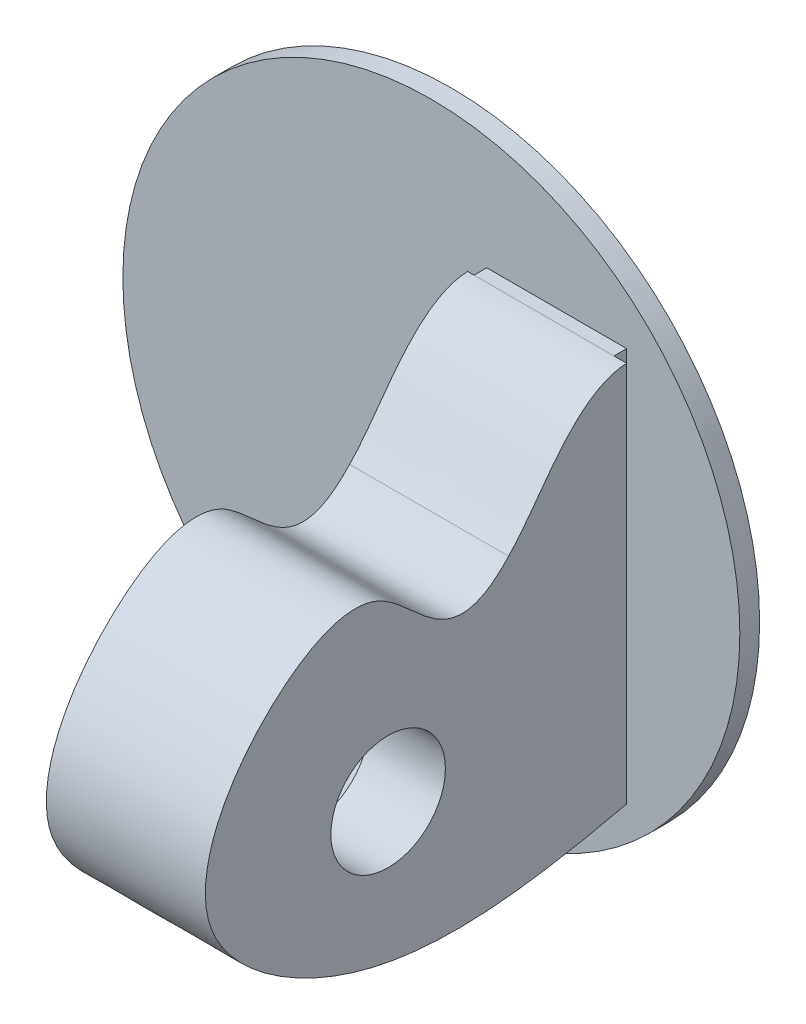
ISO-10303-21;
HEADER;
FILE_DESCRIPTION(('STEP AP214'),'2;1');
FILE_NAME('part.step','',(''),(''),'','','');
FILE_SCHEMA(('AUTOMOTIVE_DESIGN { 1 0 10303 214 1 1 1 1 }'));
ENDSEC;
DATA;
#1=APPLICATION_CONTEXT('core data for automotive mechanical design processes');
#2=APPLICATION_PROTOCOL_DEFINITION('international standard','automotive_design',2000,#1);
#3=PRODUCT_CONTEXT('',#1,'mechanical');
#4=PRODUCT('Part','Part','',(#3));
#5=PRODUCT_RELATED_PRODUCT_CATEGORY('part','',(#4));
#6=PRODUCT_DEFINITION_FORMATION('','',#4);
#7=PRODUCT_DEFINITION_CONTEXT('part definition',#1,'design');
#8=PRODUCT_DEFINITION('design','',#6,#7);
#9=PRODUCT_DEFINITION_SHAPE('','',#8);
#10=(LENGTH_UNIT() NAMED_UNIT(*) SI_UNIT(.MILLI.,.METRE.));
#11=(NAMED_UNIT(*) PLANE_ANGLE_UNIT() SI_UNIT($,.RADIAN.));
#12=(NAMED_UNIT(*) SI_UNIT($,.STERADIAN.) SOLID_ANGLE_UNIT());
#13=UNCERTAINTY_MEASURE_WITH_UNIT(LENGTH_MEASURE(1.E-05),#10,'distance_accuracy_value','');
#14=(GEOMETRIC_REPRESENTATION_CONTEXT(3) GLOBAL_UNCERTAINTY_ASSIGNED_CONTEXT((#13)) GLOBAL_UNIT_ASSIGNED_CONTEXT((#10,
#11,#12)) REPRESENTATION_CONTEXT('',''));
#15=CARTESIAN_POINT('',(0.,0.,0.));
#16=DIRECTION('',(0.,0.,1.));
#17=DIRECTION('',(1.,0.,0.));
#18=AXIS2_PLACEMENT_3D('',#15,#16,#17);
#19=CARTESIAN_POINT('',(0.,0.,3.1112810740788));
#20=DIRECTION('',(0.,0.,1.));
#21=DIRECTION('',(1.,0.,0.));
#22=AXIS2_PLACEMENT_3D('',#19,#20,#21);
#23=PLANE('',#22);
#24=CARTESIAN_POINT('',(0.,0.,3.1112810740788));
#25=DIRECTION('',(0.,0.,1.));
#26=DIRECTION('',(1.,0.,0.));
#27=AXIS2_PLACEMENT_3D('',#24,#25,#26);
#28=CIRCLE('',#27,48.5);
#29=CARTESIAN_POINT('',(48.5,0.,3.1112810740788));
#30=VERTEX_POINT('',#29);
#31=EDGE_CURVE('E11',#30,#30,#28,.T.);
#32=ORIENTED_EDGE('',*,*,#31,.T.);
#33=EDGE_LOOP('',(#32));
#34=FACE_BOUND('',#33,.T.);
#35=DIRECTION('',(-1.,0.,0.));
#36=VECTOR('',#35,1.);
#37=CARTESIAN_POINT('',(30.7069914702559,29.9017374355421,3.1112810740788));
#38=LINE('',#37,#36);
#39=CARTESIAN_POINT('',(30.7069914702559,29.9017374355421,3.1112810740788));
#40=VERTEX_POINT('',#39);
#41=CARTESIAN_POINT('',(8.70699147025594,29.9017374355421,3.1112810740788));
#42=VERTEX_POINT('',#41);
#43=EDGE_CURVE('E270',#40,#42,#38,.T.);
#44=ORIENTED_EDGE('',*,*,#43,.F.);
#45=DIRECTION('',(0.,1.,0.));
#46=VECTOR('',#45,1.);
#47=CARTESIAN_POINT('',(30.7069914702559,29.9017374355421,3.1112810740788));
#48=LINE('',#47,#46);
#49=CARTESIAN_POINT('',(30.7069914702559,-30.0982625644579,3.1112810740788));
#50=VERTEX_POINT('',#49);
#51=EDGE_CURVE('E273',#50,#40,#48,.T.);
#52=ORIENTED_EDGE('',*,*,#51,.F.);
#53=DIRECTION('',(1.,0.,0.));
#54=VECTOR('',#53,1.);
#55=CARTESIAN_POINT('',(30.7069914702559,-30.0982625644579,3.1112810740788));
#56=LINE('',#55,#54);
#57=CARTESIAN_POINT('',(8.70699147025594,-30.0982625644579,3.1112810740788));
#58=VERTEX_POINT('',#57);
#59=EDGE_CURVE('E263',#58,#50,#56,.T.);
#60=ORIENTED_EDGE('',*,*,#59,.F.);
#61=DIRECTION('',(0.,-1.,0.));
#62=VECTOR('',#61,1.);
#63=CARTESIAN_POINT('',(8.70699147025594,29.9017374355421,3.1112810740788));
#64=LINE('',#63,#62);
#65=EDGE_CURVE('E267',#42,#58,#64,.T.);
#66=ORIENTED_EDGE('',*,*,#65,.F.);
#67=EDGE_LOOP('',(#44,#52,#60,#66));
#68=FACE_BOUND('',#67,.T.);
#69=ADVANCED_FACE('F44',(#34,#68),#23,.T.);
#70=CARTESIAN_POINT('',(0.,0.,3.1112810740788));
#71=DIRECTION('',(0.,0.,-1.));
#72=DIRECTION('',(-1.,0.,0.));
#73=AXIS2_PLACEMENT_3D('',#70,#71,#72);
#74=CYLINDRICAL_SURFACE('',#73,48.5);
#75=ORIENTED_EDGE('',*,*,#31,.F.);
#76=EDGE_LOOP('',(#75));
#77=FACE_BOUND('',#76,.T.);
#78=CARTESIAN_POINT('',(0.,0.,0.));
#79=DIRECTION('',(0.,0.,1.));
#80=DIRECTION('',(1.,0.,0.));
#81=AXIS2_PLACEMENT_3D('',#78,#79,#80);
#82=CIRCLE('',#81,48.5);
#83=CARTESIAN_POINT('',(48.5,0.,0.));
#84=VERTEX_POINT('',#83);
#85=EDGE_CURVE('E48',#84,#84,#82,.T.);
#86=ORIENTED_EDGE('',*,*,#85,.T.);
#87=EDGE_LOOP('',(#86));
#88=FACE_BOUND('',#87,.T.);
#89=ADVANCED_FACE('F46',(#77,#88),#74,.T.);
#90=CARTESIAN_POINT('',(0.,0.,0.));
#91=DIRECTION('',(0.,0.,1.));
#92=DIRECTION('',(1.,0.,0.));
#93=AXIS2_PLACEMENT_3D('',#90,#91,#92);
#94=PLANE('',#93);
#95=ORIENTED_EDGE('',*,*,#85,.F.);
#96=EDGE_LOOP('',(#95));
#97=FACE_BOUND('',#96,.T.);
#98=ADVANCED_FACE('F232',(#97),#94,.F.);
#99=CARTESIAN_POINT('',(30.7069914702559,29.9017374355421,5.1112810740788));
#100=DIRECTION('',(-1.,0.,0.));
#101=DIRECTION('',(0.,0.,1.));
#102=AXIS2_PLACEMENT_3D('',#99,#100,#101);
#103=PLANE('',#102);
#104=ORIENTED_EDGE('',*,*,#51,.T.);
#105=DIRECTION('',(0.,0.,-1.));
#106=VECTOR('',#105,1.);
#107=CARTESIAN_POINT('',(30.7069914702559,29.9017374355421,5.1112810740788));
#108=LINE('',#107,#106);
#109=CARTESIAN_POINT('',(30.7069914702559,29.9017374355421,5.1112810740788));
#110=VERTEX_POINT('',#109);
#111=EDGE_CURVE('E246',#110,#40,#108,.T.);
#112=ORIENTED_EDGE('',*,*,#111,.F.);
#113=DIRECTION('',(0.,1.,0.));
#114=VECTOR('',#113,1.);
#115=CARTESIAN_POINT('',(30.7069914702559,29.9017374355421,5.1112810740788));
#116=LINE('',#115,#114);
#117=CARTESIAN_POINT('',(30.7069914702559,-30.0982625644579,5.1112810740788));
#118=VERTEX_POINT('',#117);
#119=EDGE_CURVE('E266',#118,#110,#116,.T.);
#120=ORIENTED_EDGE('',*,*,#119,.F.);
#121=DIRECTION('',(0.,0.,-1.));
#122=VECTOR('',#121,1.);
#123=CARTESIAN_POINT('',(30.7069914702559,-30.0982625644579,5.1112810740788));
#124=LINE('',#123,#122);
#125=EDGE_CURVE('E258',#118,#50,#124,.T.);
#126=ORIENTED_EDGE('',*,*,#125,.T.);
#127=EDGE_LOOP('',(#104,#112,#120,#126));
#128=FACE_BOUND('',#127,.T.);
#129=ADVANCED_FACE('F228',(#128),#103,.F.);
#130=CARTESIAN_POINT('',(30.7069914702559,29.9017374355421,5.1112810740788));
#131=DIRECTION('',(0.,-1.,0.));
#132=DIRECTION('',(0.,0.,-1.));
#133=AXIS2_PLACEMENT_3D('',#130,#131,#132);
#134=PLANE('',#133);
#135=ORIENTED_EDGE('',*,*,#43,.T.);
#136=DIRECTION('',(0.,0.,-1.));
#137=VECTOR('',#136,1.);
#138=CARTESIAN_POINT('',(8.70699147025594,29.9017374355421,5.1112810740788));
#139=LINE('',#138,#137);
#140=CARTESIAN_POINT('',(8.70699147025594,29.9017374355421,5.1112810740788));
#141=VERTEX_POINT('',#140);
#142=EDGE_CURVE('E248',#141,#42,#139,.T.);
#143=ORIENTED_EDGE('',*,*,#142,.F.);
#144=DIRECTION('',(-1.,0.,0.));
#145=VECTOR('',#144,1.);
#146=CARTESIAN_POINT('',(30.7069914702559,29.9017374355421,5.1112810740788));
#147=LINE('',#146,#145);
#148=EDGE_CURVE('E284',#110,#141,#147,.T.);
#149=ORIENTED_EDGE('',*,*,#148,.F.);
#150=ORIENTED_EDGE('',*,*,#111,.T.);
#151=EDGE_LOOP('',(#135,#143,#149,#150));
#152=FACE_BOUND('',#151,.T.);
#153=ADVANCED_FACE('F224',(#152),#134,.F.);
#154=CARTESIAN_POINT('',(8.70699147025594,29.9017374355421,5.1112810740788));
#155=DIRECTION('',(1.,0.,0.));
#156=DIRECTION('',(0.,1.,0.));
#157=AXIS2_PLACEMENT_3D('',#154,#155,#156);
#158=PLANE('',#157);
#159=ORIENTED_EDGE('',*,*,#65,.T.);
#160=DIRECTION('',(0.,0.,-1.));
#161=VECTOR('',#160,1.);
#162=CARTESIAN_POINT('',(8.70699147025594,-30.0982625644579,5.1112810740788));
#163=LINE('',#162,#161);
#164=CARTESIAN_POINT('',(8.70699147025594,-30.0982625644579,5.1112810740788));
#165=VERTEX_POINT('',#164);
#166=EDGE_CURVE('E68',#165,#58,#163,.T.);
#167=ORIENTED_EDGE('',*,*,#166,.F.);
#168=DIRECTION('',(0.,-1.,0.));
#169=VECTOR('',#168,1.);
#170=CARTESIAN_POINT('',(8.70699147025594,29.9017374355421,5.1112810740788));
#171=LINE('',#170,#169);
#172=EDGE_CURVE('E280',#141,#165,#171,.T.);
#173=ORIENTED_EDGE('',*,*,#172,.F.);
#174=ORIENTED_EDGE('',*,*,#142,.T.);
#175=EDGE_LOOP('',(#159,#167,#173,#174));
#176=FACE_BOUND('',#175,.T.);
#177=ADVANCED_FACE('F221',(#176),#158,.F.);
#178=CARTESIAN_POINT('',(30.7069914702559,-30.0982625644579,5.1112810740788));
#179=DIRECTION('',(0.,1.,0.));
#180=DIRECTION('',(-1.,0.,0.));
#181=AXIS2_PLACEMENT_3D('',#178,#179,#180);
#182=PLANE('',#181);
#183=ORIENTED_EDGE('',*,*,#59,.T.);
#184=ORIENTED_EDGE('',*,*,#125,.F.);
#185=DIRECTION('',(1.,0.,0.));
#186=VECTOR('',#185,1.);
#187=CARTESIAN_POINT('',(30.7069914702559,-30.0982625644579,5.1112810740788));
#188=LINE('',#187,#186);
#189=EDGE_CURVE('E262',#165,#118,#188,.T.);
#190=ORIENTED_EDGE('',*,*,#189,.F.);
#191=ORIENTED_EDGE('',*,*,#166,.T.);
#192=EDGE_LOOP('',(#183,#184,#190,#191));
#193=FACE_BOUND('',#192,.T.);
#194=ADVANCED_FACE('F217',(#193),#182,.F.);
#195=CARTESIAN_POINT('',(7.70699147025594,0.,5.1112810740788));
#196=DIRECTION('',(0.,0.,1.));
#197=DIRECTION('',(1.,0.,0.));
#198=AXIS2_PLACEMENT_3D('',#195,#196,#197);
#199=PLANE('',#198);
#200=DIRECTION('',(1.,0.,0.));
#201=VECTOR('',#200,1.);
#202=CARTESIAN_POINT('',(7.70699147025594,-30.0982625644579,5.1112810740788));
#203=LINE('',#202,#201);
#204=CARTESIAN_POINT('',(32.7069914702559,-30.0982625644579,5.1112810740788));
#205=VERTEX_POINT('',#204);
#206=EDGE_CURVE('E294',#118,#205,#203,.T.);
#207=ORIENTED_EDGE('',*,*,#206,.F.);
#208=ORIENTED_EDGE('',*,*,#119,.T.);
#209=DIRECTION('',(1.,0.,0.));
#210=VECTOR('',#209,1.);
#211=CARTESIAN_POINT('',(7.70699147025594,29.9017374355421,5.1112810740788));
#212=LINE('',#211,#210);
#213=CARTESIAN_POINT('',(32.7069914702559,29.9017374355421,5.1112810740788));
#214=VERTEX_POINT('',#213);
#215=EDGE_CURVE('E300',#110,#214,#212,.T.);
#216=ORIENTED_EDGE('',*,*,#215,.T.);
#217=DIRECTION('',(0.,-1.,0.));
#218=VECTOR('',#217,1.);
#219=CARTESIAN_POINT('',(32.7069914702559,0.,5.1112810740788));
#220=LINE('',#219,#218);
#221=EDGE_CURVE('E186',#214,#205,#220,.T.);
#222=ORIENTED_EDGE('',*,*,#221,.T.);
#223=EDGE_LOOP('',(#207,#208,#216,#222));
#224=FACE_BOUND('',#223,.T.);
#225=ADVANCED_FACE('F220',(#224),#199,.F.);
#226=CARTESIAN_POINT('',(7.70699147025594,29.9017374355421,5.1112810740788));
#227=VERTEX_POINT('',#226);
#228=EDGE_CURVE('E276',#227,#141,#212,.T.);
#229=ORIENTED_EDGE('',*,*,#228,.T.);
#230=ORIENTED_EDGE('',*,*,#172,.T.);
#231=CARTESIAN_POINT('',(7.70699147025594,-30.0982625644579,5.1112810740788));
#232=VERTEX_POINT('',#231);
#233=EDGE_CURVE('E296',#232,#165,#203,.T.);
#234=ORIENTED_EDGE('',*,*,#233,.F.);
#235=DIRECTION('',(0.,-1.,0.));
#236=VECTOR('',#235,1.);
#237=CARTESIAN_POINT('',(7.70699147025594,0.,5.1112810740788));
#238=LINE('',#237,#236);
#239=EDGE_CURVE('E295',#227,#232,#238,.T.);
#240=ORIENTED_EDGE('',*,*,#239,.F.);
#241=EDGE_LOOP('',(#229,#230,#234,#240));
#242=FACE_BOUND('',#241,.T.);
#243=ADVANCED_FACE('F214',(#242),#199,.F.);
#244=CARTESIAN_POINT('',(7.70699147025594,12.9185801119361,23.6727907810343));
#245=CARTESIAN_POINT('',(7.70699147025594,17.4253852348461,19.019771768427));
#246=CARTESIAN_POINT('',(7.70699147025594,30.54597843189,13.1044488589579));
#247=CARTESIAN_POINT('',(7.70699147025594,29.8774269491727,3.77192315663627));
#248=CARTESIAN_POINT('',(7.70699147025594,29.9017374355421,3.11128107407879));
#249=B_SPLINE_CURVE_WITH_KNOTS('',3,(#244,#245,#246,#247,#248),.UNSPECIFIED.,.F.,.F.,(4,1,4),
(0.,0.927274153157038,1.),.UNSPECIFIED.);
#250=DIRECTION('',(1.,0.,0.));
#251=VECTOR('',#250,1.);
#252=SURFACE_OF_LINEAR_EXTRUSION('',#249,#251);
#253=DIRECTION('',(1.,0.,0.));
#254=VECTOR('',#253,1.);
#255=CARTESIAN_POINT('',(7.70699147025594,12.9185801119361,23.6727907810343));
#256=LINE('',#255,#254);
#257=CARTESIAN_POINT('',(7.70699147025594,12.9185801119361,23.6727907810343));
#258=VERTEX_POINT('',#257);
#259=CARTESIAN_POINT('',(32.7069914702559,12.9185801119361,23.6727907810343));
#260=VERTEX_POINT('',#259);
#261=EDGE_CURVE('E291',#258,#260,#256,.T.);
#262=ORIENTED_EDGE('',*,*,#261,.T.);
#263=CARTESIAN_POINT('',(32.7069914702559,12.9185801119361,23.6727907810343));
#264=CARTESIAN_POINT('',(32.7069914702559,17.4253852348461,19.019771768427));
#265=CARTESIAN_POINT('',(32.7069914702559,30.54597843189,13.1044488589579));
#266=CARTESIAN_POINT('',(32.7069914702559,29.8774269491727,3.77192315663627));
#267=CARTESIAN_POINT('',(32.7069914702559,29.9017374355421,3.11128107407879));
#268=B_SPLINE_CURVE_WITH_KNOTS('',3,(#263,#264,#265,#266,#267),.UNSPECIFIED.,.F.,.F.,(4,1,4),
(0.,0.927274153157038,1.),.UNSPECIFIED.);
#269=EDGE_CURVE('E154',#260,#214,#268,.T.);
#270=ORIENTED_EDGE('',*,*,#269,.T.);
#271=ORIENTED_EDGE('',*,*,#215,.F.);
#272=ORIENTED_EDGE('',*,*,#148,.T.);
#273=ORIENTED_EDGE('',*,*,#228,.F.);
#274=EDGE_CURVE('E193',#258,#227,#249,.T.);
#275=ORIENTED_EDGE('',*,*,#274,.F.);
#276=EDGE_LOOP('',(#262,#270,#271,#272,#273,#275));
#277=FACE_BOUND('',#276,.T.);
#278=ADVANCED_FACE('F209',(#277),#252,.F.);
#279=CARTESIAN_POINT('',(7.70699147025594,-30.0982625644579,5.11128107407879));
#280=CARTESIAN_POINT('',(7.70699147025594,-33.7436246575606,21.0676828271333));
#281=CARTESIAN_POINT('',(7.70699147025594,-37.9349639980134,45.9770740835832));
#282=CARTESIAN_POINT('',(7.70699147025594,-13.9107640488883,77.0147211662298));
#283=CARTESIAN_POINT('',(7.70699147025594,10.4858105730502,65.3805760032116));
#284=CARTESIAN_POINT('',(7.70699147025594,23.797763225656,41.8970754374423));
#285=CARTESIAN_POINT('',(7.70699147025594,2.78348011007688,33.0376365020306));
#286=CARTESIAN_POINT('',(7.70699147025594,12.9185801119361,23.6727907810343));
#287=B_SPLINE_CURVE_WITH_KNOTS('',3,(#279,#280,#281,#282,#283,#284,#285,#286),.UNSPECIFIED.,.F.,
.F.,(4,1,1,1,1,4),(0.,0.3600579269767,0.526916248276504,0.718382938550825,0.849564348586135,1.),.UNSPECIFIED.);
#288=DIRECTION('',(1.,0.,0.));
#289=VECTOR('',#288,1.);
#290=SURFACE_OF_LINEAR_EXTRUSION('',#287,#289);
#291=ORIENTED_EDGE('',*,*,#233,.T.);
#292=ORIENTED_EDGE('',*,*,#189,.T.);
#293=ORIENTED_EDGE('',*,*,#206,.T.);
#294=CARTESIAN_POINT('',(32.7069914702559,-30.0982625644579,5.11128107407879));
#295=CARTESIAN_POINT('',(32.7069914702559,-33.7436246575606,21.0676828271333));
#296=CARTESIAN_POINT('',(32.7069914702559,-37.9349639980134,45.9770740835832));
#297=CARTESIAN_POINT('',(32.7069914702559,-13.9107640488883,77.0147211662298));
#298=CARTESIAN_POINT('',(32.7069914702559,10.4858105730502,65.3805760032116));
#299=CARTESIAN_POINT('',(32.7069914702559,23.797763225656,41.8970754374423));
#300=CARTESIAN_POINT('',(32.7069914702559,2.78348011007688,33.0376365020306));
#301=CARTESIAN_POINT('',(32.7069914702559,12.9185801119361,23.6727907810343));
#302=B_SPLINE_CURVE_WITH_KNOTS('',3,(#294,#295,#296,#297,#298,#299,#300,#301),.UNSPECIFIED.,.F.,
.F.,(4,1,1,1,1,4),(0.,0.3600579269767,0.526916248276504,0.718382938550825,0.849564348586135,1.),.UNSPECIFIED.);
#303=EDGE_CURVE('E159',#205,#260,#302,.T.);
#304=ORIENTED_EDGE('',*,*,#303,.T.);
#305=ORIENTED_EDGE('',*,*,#261,.F.);
#306=EDGE_CURVE('E200',#232,#258,#287,.T.);
#307=ORIENTED_EDGE('',*,*,#306,.F.);
#308=EDGE_LOOP('',(#291,#292,#293,#304,#305,#307));
#309=FACE_BOUND('',#308,.T.);
#310=ADVANCED_FACE('F213',(#309),#290,.F.);
#311=CARTESIAN_POINT('',(7.70699147025594,0.,0.));
#312=DIRECTION('',(1.,0.,0.));
#313=DIRECTION('',(0.,0.,-1.));
#314=AXIS2_PLACEMENT_3D('',#311,#312,#313);
#315=PLANE('',#314);
#316=CARTESIAN_POINT('',(7.70699147025594,-15.353495735128,55.0227081931928));
#317=DIRECTION('',(-1.,0.,0.));
#318=DIRECTION('',(0.,0.,1.));
#319=AXIS2_PLACEMENT_3D('',#316,#317,#318);
#320=CIRCLE('',#319,1.5);
#321=CARTESIAN_POINT('',(7.70699147025594,-15.353495735128,56.5227081931928));
#322=VERTEX_POINT('',#321);
#323=EDGE_CURVE('E631',#322,#322,#320,.T.);
#324=ORIENTED_EDGE('',*,*,#323,.F.);
#325=EDGE_LOOP('',(#324));
#326=FACE_BOUND('',#325,.T.);
#327=CARTESIAN_POINT('',(7.70699147025594,-6.35349573512802,9.30040371325223));
#328=DIRECTION('',(-1.,0.,0.));
#329=DIRECTION('',(0.,0.,1.));
#330=AXIS2_PLACEMENT_3D('',#327,#328,#329);
#331=CIRCLE('',#330,1.5);
#332=CARTESIAN_POINT('',(7.70699147025594,-6.35349573512802,10.8004037132522));
#333=VERTEX_POINT('',#332);
#334=EDGE_CURVE('E639',#333,#333,#331,.T.);
#335=ORIENTED_EDGE('',*,*,#334,.F.);
#336=EDGE_LOOP('',(#335));
#337=FACE_BOUND('',#336,.T.);
#338=CARTESIAN_POINT('',(7.70699147025594,-15.353495735128,9.30040371325223));
#339=DIRECTION('',(-1.,0.,0.));
#340=DIRECTION('',(0.,0.,1.));
#341=AXIS2_PLACEMENT_3D('',#338,#339,#340);
#342=CIRCLE('',#341,1.5);
#343=CARTESIAN_POINT('',(7.70699147025594,-15.353495735128,10.8004037132522));
#344=VERTEX_POINT('',#343);
#345=EDGE_CURVE('E640',#344,#344,#342,.T.);
#346=ORIENTED_EDGE('',*,*,#345,.F.);
#347=EDGE_LOOP('',(#346));
#348=FACE_BOUND('',#347,.T.);
#349=CARTESIAN_POINT('',(7.70699147025594,-6.35349573512802,55.0227081931928));
#350=DIRECTION('',(-1.,0.,0.));
#351=DIRECTION('',(0.,0.,1.));
#352=AXIS2_PLACEMENT_3D('',#349,#350,#351);
#353=CIRCLE('',#352,1.5);
#354=CARTESIAN_POINT('',(7.70699147025594,-6.35349573512802,56.5227081931928));
#355=VERTEX_POINT('',#354);
#356=EDGE_CURVE('E627',#355,#355,#353,.T.);
#357=ORIENTED_EDGE('',*,*,#356,.F.);
#358=EDGE_LOOP('',(#357));
#359=FACE_BOUND('',#358,.T.);
#360=DIRECTION('',(0.,-1.,0.));
#361=VECTOR('',#360,1.);
#362=CARTESIAN_POINT('',(7.70699147025594,-0.440784793108259,52.4525194798234));
#363=LINE('',#362,#361);
#364=CARTESIAN_POINT('',(7.70699147025594,-0.440784793108259,52.4525194798234));
#365=VERTEX_POINT('',#364);
#366=CARTESIAN_POINT('',(7.70699147025594,-21.4407847931083,52.4525194798234));
#367=VERTEX_POINT('',#366);
#368=EDGE_CURVE('E152',#365,#367,#363,.T.);
#369=ORIENTED_EDGE('',*,*,#368,.T.);
#370=DIRECTION('',(0.,0.,1.));
#371=VECTOR('',#370,1.);
#372=CARTESIAN_POINT('',(7.70699147025594,-21.4407847931083,11.4525194798234));
#373=LINE('',#372,#371);
#374=CARTESIAN_POINT('',(7.70699147025594,-21.4407847931083,11.4525194798234));
#375=VERTEX_POINT('',#374);
#376=EDGE_CURVE('E60',#375,#367,#373,.T.);
#377=ORIENTED_EDGE('',*,*,#376,.F.);
#378=DIRECTION('',(0.,-1.,0.));
#379=VECTOR('',#378,1.);
#380=CARTESIAN_POINT('',(7.70699147025594,-0.440784793108259,11.4525194798233));
#381=LINE('',#380,#379);
#382=CARTESIAN_POINT('',(7.70699147025594,-0.440784793108259,11.4525194798233));
#383=VERTEX_POINT('',#382);
#384=EDGE_CURVE('E140',#383,#375,#381,.T.);
#385=ORIENTED_EDGE('',*,*,#384,.F.);
#386=DIRECTION('',(0.,0.,1.));
#387=VECTOR('',#386,1.);
#388=CARTESIAN_POINT('',(7.70699147025594,-0.440784793108259,11.4525194798233));
#389=LINE('',#388,#387);
#390=EDGE_CURVE('E146',#383,#365,#389,.T.);
#391=ORIENTED_EDGE('',*,*,#390,.T.);
#392=EDGE_LOOP('',(#369,#377,#385,#391));
#393=FACE_BOUND('',#392,.T.);
#394=ORIENTED_EDGE('',*,*,#274,.T.);
#395=ORIENTED_EDGE('',*,*,#239,.T.);
#396=ORIENTED_EDGE('',*,*,#306,.T.);
#397=EDGE_LOOP('',(#394,#395,#396));
#398=FACE_BOUND('',#397,.T.);
#399=ADVANCED_FACE('F149',(#326,#337,#348,#359,#393,#398),#315,.F.);
#400=CARTESIAN_POINT('',(32.7069914702559,0.,0.));
#401=DIRECTION('',(1.,0.,0.));
#402=DIRECTION('',(0.,0.,-1.));
#403=AXIS2_PLACEMENT_3D('',#400,#401,#402);
#404=PLANE('',#403);
#405=CARTESIAN_POINT('',(32.7069914702559,-11.0247568494533,42.6126432744047));
#406=DIRECTION('',(1.,0.,0.));
#407=DIRECTION('',(0.,0.,-1.));
#408=AXIS2_PLACEMENT_3D('',#405,#406,#407);
#409=CIRCLE('',#408,9.);
#410=CARTESIAN_POINT('',(32.7069914702559,-11.0247568494533,33.6126432744047));
#411=VERTEX_POINT('',#410);
#412=EDGE_CURVE('E137',#411,#411,#409,.T.);
#413=ORIENTED_EDGE('',*,*,#412,.F.);
#414=EDGE_LOOP('',(#413));
#415=FACE_BOUND('',#414,.T.);
#416=ORIENTED_EDGE('',*,*,#269,.F.);
#417=ORIENTED_EDGE('',*,*,#303,.F.);
#418=ORIENTED_EDGE('',*,*,#221,.F.);
#419=EDGE_LOOP('',(#416,#417,#418));
#420=FACE_BOUND('',#419,.T.);
#421=ADVANCED_FACE('F325',(#415,#420),#404,.T.);
#422=CARTESIAN_POINT('',(20.7069914702559,-21.4407847931083,11.4525194798234));
#423=DIRECTION('',(0.,-1.,0.));
#424=DIRECTION('',(0.,0.,-1.));
#425=AXIS2_PLACEMENT_3D('',#422,#423,#424);
#426=PLANE('',#425);
#427=ORIENTED_EDGE('',*,*,#376,.T.);
#428=DIRECTION('',(-1.,0.,0.));
#429=VECTOR('',#428,1.);
#430=CARTESIAN_POINT('',(20.7069914702559,-21.4407847931083,52.4525194798234));
#431=LINE('',#430,#429);
#432=CARTESIAN_POINT('',(20.7069914702559,-21.4407847931083,52.4525194798234));
#433=VERTEX_POINT('',#432);
#434=EDGE_CURVE('E168',#433,#367,#431,.T.);
#435=ORIENTED_EDGE('',*,*,#434,.F.);
#436=DIRECTION('',(0.,0.,1.));
#437=VECTOR('',#436,1.);
#438=CARTESIAN_POINT('',(20.7069914702559,-21.4407847931083,11.4525194798234));
#439=LINE('',#438,#437);
#440=CARTESIAN_POINT('',(20.7069914702559,-21.4407847931083,11.4525194798234));
#441=VERTEX_POINT('',#440);
#442=EDGE_CURVE('E131',#441,#433,#439,.T.);
#443=ORIENTED_EDGE('',*,*,#442,.F.);
#444=DIRECTION('',(-1.,0.,0.));
#445=VECTOR('',#444,1.);
#446=CARTESIAN_POINT('',(20.7069914702559,-21.4407847931083,11.4525194798234));
#447=LINE('',#446,#445);
#448=EDGE_CURVE('E127',#441,#375,#447,.T.);
#449=ORIENTED_EDGE('',*,*,#448,.T.);
#450=EDGE_LOOP('',(#427,#435,#443,#449));
#451=FACE_BOUND('',#450,.T.);
#452=ADVANCED_FACE('F129',(#451),#426,.F.);
#453=CARTESIAN_POINT('',(20.7069914702559,-0.440784793108259,11.4525194798233));
#454=DIRECTION('',(0.,0.,-1.));
#455=DIRECTION('',(0.,1.,0.));
#456=AXIS2_PLACEMENT_3D('',#453,#454,#455);
#457=PLANE('',#456);
#458=ORIENTED_EDGE('',*,*,#384,.T.);
#459=ORIENTED_EDGE('',*,*,#448,.F.);
#460=DIRECTION('',(0.,-1.,0.));
#461=VECTOR('',#460,1.);
#462=CARTESIAN_POINT('',(20.7069914702559,-0.440784793108259,11.4525194798233));
#463=LINE('',#462,#461);
#464=CARTESIAN_POINT('',(20.7069914702559,-0.440784793108259,11.4525194798233));
#465=VERTEX_POINT('',#464);
#466=EDGE_CURVE('E164',#465,#441,#463,.T.);
#467=ORIENTED_EDGE('',*,*,#466,.F.);
#468=DIRECTION('',(-1.,0.,0.));
#469=VECTOR('',#468,1.);
#470=CARTESIAN_POINT('',(20.7069914702559,-0.440784793108259,11.4525194798233));
#471=LINE('',#470,#469);
#472=EDGE_CURVE('E136',#465,#383,#471,.T.);
#473=ORIENTED_EDGE('',*,*,#472,.T.);
#474=EDGE_LOOP('',(#458,#459,#467,#473));
#475=FACE_BOUND('',#474,.T.);
#476=ADVANCED_FACE('F141',(#475),#457,.F.);
#477=CARTESIAN_POINT('',(20.7069914702559,-0.440784793108259,11.4525194798233));
#478=DIRECTION('',(0.,-1.,0.));
#479=DIRECTION('',(0.,0.,-1.));
#480=AXIS2_PLACEMENT_3D('',#477,#478,#479);
#481=PLANE('',#480);
#482=ORIENTED_EDGE('',*,*,#390,.F.);
#483=ORIENTED_EDGE('',*,*,#472,.F.);
#484=DIRECTION('',(0.,0.,1.));
#485=VECTOR('',#484,1.);
#486=CARTESIAN_POINT('',(20.7069914702559,-0.440784793108259,11.4525194798233));
#487=LINE('',#486,#485);
#488=CARTESIAN_POINT('',(20.7069914702559,-0.440784793108259,52.4525194798234));
#489=VERTEX_POINT('',#488);
#490=EDGE_CURVE('E167',#465,#489,#487,.T.);
#491=ORIENTED_EDGE('',*,*,#490,.T.);
#492=DIRECTION('',(-1.,0.,0.));
#493=VECTOR('',#492,1.);
#494=CARTESIAN_POINT('',(20.7069914702559,-0.440784793108259,52.4525194798234));
#495=LINE('',#494,#493);
#496=EDGE_CURVE('E610',#489,#365,#495,.T.);
#497=ORIENTED_EDGE('',*,*,#496,.T.);
#498=EDGE_LOOP('',(#482,#483,#491,#497));
#499=FACE_BOUND('',#498,.T.);
#500=ADVANCED_FACE('F487',(#499),#481,.T.);
#501=CARTESIAN_POINT('',(20.7069914702559,-0.440784793108259,52.4525194798234));
#502=DIRECTION('',(0.,0.,-1.));
#503=DIRECTION('',(-1.,0.,0.));
#504=AXIS2_PLACEMENT_3D('',#501,#502,#503);
#505=PLANE('',#504);
#506=ORIENTED_EDGE('',*,*,#368,.F.);
#507=ORIENTED_EDGE('',*,*,#496,.F.);
#508=DIRECTION('',(0.,-1.,0.));
#509=VECTOR('',#508,1.);
#510=CARTESIAN_POINT('',(20.7069914702559,-0.440784793108259,52.4525194798234));
#511=LINE('',#510,#509);
#512=EDGE_CURVE('E171',#489,#433,#511,.T.);
#513=ORIENTED_EDGE('',*,*,#512,.T.);
#514=ORIENTED_EDGE('',*,*,#434,.T.);
#515=EDGE_LOOP('',(#506,#507,#513,#514));
#516=FACE_BOUND('',#515,.T.);
#517=ADVANCED_FACE('F479',(#516),#505,.T.);
#518=CARTESIAN_POINT('',(20.7069914702559,0.,0.));
#519=DIRECTION('',(1.,0.,0.));
#520=DIRECTION('',(0.,0.,-1.));
#521=AXIS2_PLACEMENT_3D('',#518,#519,#520);
#522=PLANE('',#521);
#523=CARTESIAN_POINT('',(20.7069914702559,-11.0247568494533,42.6126432744047));
#524=DIRECTION('',(-1.,0.,0.));
#525=DIRECTION('',(0.,0.,1.));
#526=AXIS2_PLACEMENT_3D('',#523,#524,#525);
#527=CIRCLE('',#526,9.);
#528=CARTESIAN_POINT('',(20.7069914702559,-11.0247568494533,51.6126432744047));
#529=VERTEX_POINT('',#528);
#530=EDGE_CURVE('E622',#529,#529,#527,.T.);
#531=ORIENTED_EDGE('',*,*,#530,.F.);
#532=EDGE_LOOP('',(#531));
#533=FACE_BOUND('',#532,.T.);
#534=ORIENTED_EDGE('',*,*,#442,.T.);
#535=ORIENTED_EDGE('',*,*,#512,.F.);
#536=ORIENTED_EDGE('',*,*,#490,.F.);
#537=ORIENTED_EDGE('',*,*,#466,.T.);
#538=EDGE_LOOP('',(#534,#535,#536,#537));
#539=FACE_BOUND('',#538,.T.);
#540=ADVANCED_FACE('F338',(#533,#539),#522,.F.);
#541=CARTESIAN_POINT('',(34.7069914702559,-11.0247568494533,42.6126432744047));
#542=DIRECTION('',(-1.,0.,0.));
#543=DIRECTION('',(0.,0.,1.));
#544=AXIS2_PLACEMENT_3D('',#541,#542,#543);
#545=CYLINDRICAL_SURFACE('',#544,9.);
#546=ORIENTED_EDGE('',*,*,#412,.T.);
#547=EDGE_LOOP('',(#546));
#548=FACE_BOUND('',#547,.T.);
#549=ORIENTED_EDGE('',*,*,#530,.T.);
#550=EDGE_LOOP('',(#549));
#551=FACE_BOUND('',#550,.T.);
#552=ADVANCED_FACE('F368',(#548,#551),#545,.F.);
#553=CARTESIAN_POINT('',(17.7069914702559,-6.35349573512802,55.0227081931928));
#554=DIRECTION('',(-1.,0.,0.));
#555=DIRECTION('',(0.,0.,1.));
#556=AXIS2_PLACEMENT_3D('',#553,#554,#555);
#557=CYLINDRICAL_SURFACE('',#556,1.5);
#558=CARTESIAN_POINT('',(17.7069914702559,-6.35349573512802,55.0227081931928));
#559=DIRECTION('',(-1.,0.,0.));
#560=DIRECTION('',(0.,0.,1.));
#561=AXIS2_PLACEMENT_3D('',#558,#559,#560);
#562=CIRCLE('',#561,1.5);
#563=CARTESIAN_POINT('',(17.7069914702559,-6.35349573512802,56.5227081931928));
#564=VERTEX_POINT('',#563);
#565=EDGE_CURVE('E626',#564,#564,#562,.T.);
#566=ORIENTED_EDGE('',*,*,#565,.F.);
#567=EDGE_LOOP('',(#566));
#568=FACE_BOUND('',#567,.T.);
#569=ORIENTED_EDGE('',*,*,#356,.T.);
#570=EDGE_LOOP('',(#569));
#571=FACE_BOUND('',#570,.T.);
#572=ADVANCED_FACE('F373',(#568,#571),#557,.F.);
#573=CARTESIAN_POINT('',(17.7069914702559,-6.35349573512802,55.0227081931928));
#574=DIRECTION('',(-1.,0.,0.));
#575=DIRECTION('',(0.,0.,1.));
#576=AXIS2_PLACEMENT_3D('',#573,#574,#575);
#577=PLANE('',#576);
#578=ORIENTED_EDGE('',*,*,#565,.T.);
#579=EDGE_LOOP('',(#578));
#580=FACE_BOUND('',#579,.T.);
#581=ADVANCED_FACE('F378',(#580),#577,.T.);
#582=CARTESIAN_POINT('',(17.7069914702559,-15.353495735128,9.30040371325223));
#583=DIRECTION('',(-1.,0.,0.));
#584=DIRECTION('',(0.,0.,1.));
#585=AXIS2_PLACEMENT_3D('',#582,#583,#584);
#586=CYLINDRICAL_SURFACE('',#585,1.5);
#587=CARTESIAN_POINT('',(17.7069914702559,-15.353495735128,9.30040371325223));
#588=DIRECTION('',(-1.,0.,0.));
#589=DIRECTION('',(0.,0.,1.));
#590=AXIS2_PLACEMENT_3D('',#587,#588,#589);
#591=CIRCLE('',#590,1.5);
#592=CARTESIAN_POINT('',(17.7069914702559,-15.353495735128,10.8004037132522));
#593=VERTEX_POINT('',#592);
#594=EDGE_CURVE('E651',#593,#593,#591,.T.);
#595=ORIENTED_EDGE('',*,*,#594,.F.);
#596=EDGE_LOOP('',(#595));
#597=FACE_BOUND('',#596,.T.);
#598=ORIENTED_EDGE('',*,*,#345,.T.);
#599=EDGE_LOOP('',(#598));
#600=FACE_BOUND('',#599,.T.);
#601=ADVANCED_FACE('F389',(#597,#600),#586,.F.);
#602=CARTESIAN_POINT('',(17.7069914702559,-15.353495735128,9.30040371325223));
#603=DIRECTION('',(-1.,0.,0.));
#604=DIRECTION('',(0.,0.,1.));
#605=AXIS2_PLACEMENT_3D('',#602,#603,#604);
#606=PLANE('',#605);
#607=ORIENTED_EDGE('',*,*,#594,.T.);
#608=EDGE_LOOP('',(#607));
#609=FACE_BOUND('',#608,.T.);
#610=ADVANCED_FACE('F400',(#609),#606,.T.);
#611=CARTESIAN_POINT('',(17.7069914702559,-6.35349573512802,9.30040371325223));
#612=DIRECTION('',(-1.,0.,0.));
#613=DIRECTION('',(0.,0.,1.));
#614=AXIS2_PLACEMENT_3D('',#611,#612,#613);
#615=CYLINDRICAL_SURFACE('',#614,1.5);
#616=CARTESIAN_POINT('',(17.7069914702559,-6.35349573512802,9.30040371325223));
#617=DIRECTION('',(-1.,0.,0.));
#618=DIRECTION('',(0.,0.,1.));
#619=AXIS2_PLACEMENT_3D('',#616,#617,#618);
#620=CIRCLE('',#619,1.5);
#621=CARTESIAN_POINT('',(17.7069914702559,-6.35349573512802,10.8004037132522));
#622=VERTEX_POINT('',#621);
#623=EDGE_CURVE('E635',#622,#622,#620,.T.);
#624=ORIENTED_EDGE('',*,*,#623,.F.);
#625=EDGE_LOOP('',(#624));
#626=FACE_BOUND('',#625,.T.);
#627=ORIENTED_EDGE('',*,*,#334,.T.);
#628=EDGE_LOOP('',(#627));
#629=FACE_BOUND('',#628,.T.);
#630=ADVANCED_FACE('F411',(#626,#629),#615,.F.);
#631=CARTESIAN_POINT('',(17.7069914702559,-6.35349573512802,9.30040371325223));
#632=DIRECTION('',(-1.,0.,0.));
#633=DIRECTION('',(0.,0.,1.));
#634=AXIS2_PLACEMENT_3D('',#631,#632,#633);
#635=PLANE('',#634);
#636=ORIENTED_EDGE('',*,*,#623,.T.);
#637=EDGE_LOOP('',(#636));
#638=FACE_BOUND('',#637,.T.);
#639=ADVANCED_FACE('F422',(#638),#635,.T.);
#640=CARTESIAN_POINT('',(17.7069914702559,-15.353495735128,55.0227081931928));
#641=DIRECTION('',(-1.,0.,0.));
#642=DIRECTION('',(0.,0.,1.));
#643=AXIS2_PLACEMENT_3D('',#640,#641,#642);
#644=CYLINDRICAL_SURFACE('',#643,1.5);
#645=CARTESIAN_POINT('',(17.7069914702559,-15.353495735128,55.0227081931928));
#646=DIRECTION('',(-1.,0.,0.));
#647=DIRECTION('',(0.,0.,1.));
#648=AXIS2_PLACEMENT_3D('',#645,#646,#647);
#649=CIRCLE('',#648,1.5);
#650=CARTESIAN_POINT('',(17.7069914702559,-15.353495735128,56.5227081931928));
#651=VERTEX_POINT('',#650);
#652=EDGE_CURVE('E644',#651,#651,#649,.T.);
#653=ORIENTED_EDGE('',*,*,#652,.F.);
#654=EDGE_LOOP('',(#653));
#655=FACE_BOUND('',#654,.T.);
#656=ORIENTED_EDGE('',*,*,#323,.T.);
#657=EDGE_LOOP('',(#656));
#658=FACE_BOUND('',#657,.T.);
#659=ADVANCED_FACE('F433',(#655,#658),#644,.F.);
#660=CARTESIAN_POINT('',(17.7069914702559,-15.353495735128,55.0227081931928));
#661=DIRECTION('',(-1.,0.,0.));
#662=DIRECTION('',(0.,0.,1.));
#663=AXIS2_PLACEMENT_3D('',#660,#661,#662);
#664=PLANE('',#663);
#665=ORIENTED_EDGE('',*,*,#652,.T.);
#666=EDGE_LOOP('',(#665));
#667=FACE_BOUND('',#666,.T.);
#668=ADVANCED_FACE('F444',(#667),#664,.T.);
#669=CLOSED_SHELL('',(#69,#89,#98,#129,#153,#177,#194,#225,#243,#278,#310,#399,#421,#452,#476,
#500,#517,#540,#552,#572,#581,#601,#610,#630,#639,#659,#668));
#670=MANIFOLD_SOLID_BREP('B2',#669);
#671=ADVANCED_BREP_SHAPE_REPRESENTATION('',(#18,#670),#14);
#672=SHAPE_DEFINITION_REPRESENTATION(#9,#671);
ENDSEC;
END-ISO-10303-21;
